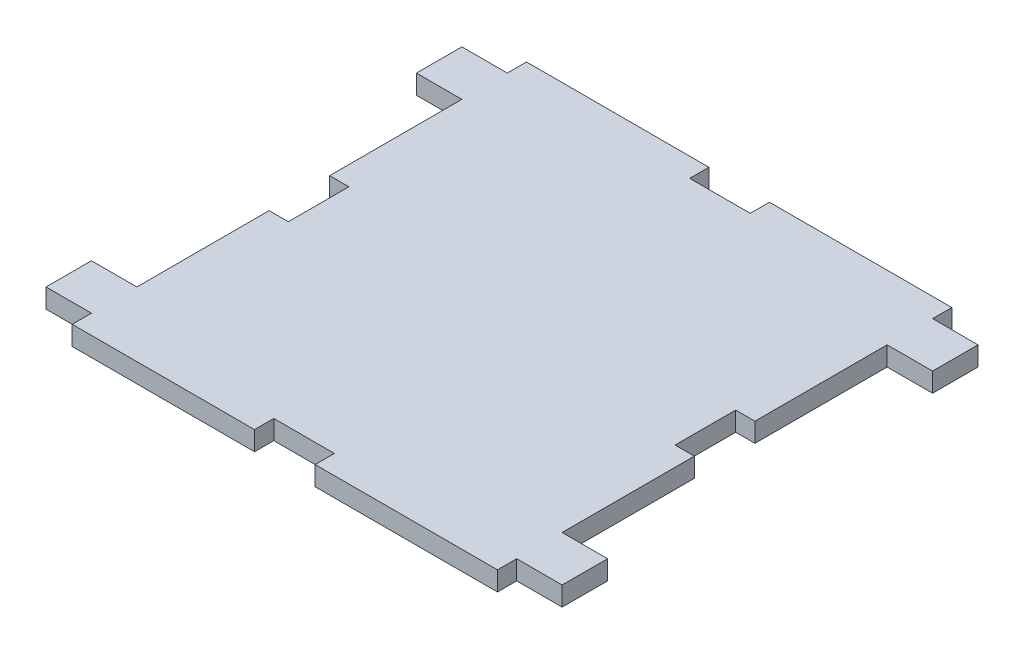
ISO-10303-21;
HEADER;
FILE_DESCRIPTION(('STEP AP214'),'2;1');
FILE_NAME('part.step','',(''),(''),'','','');
FILE_SCHEMA(('AUTOMOTIVE_DESIGN { 1 0 10303 214 1 1 1 1 }'));
ENDSEC;
DATA;
#1=APPLICATION_CONTEXT('core data for automotive mechanical design processes');
#2=APPLICATION_PROTOCOL_DEFINITION('international standard','automotive_design',2000,#1);
#3=PRODUCT_CONTEXT('',#1,'mechanical');
#4=PRODUCT('Part','Part','',(#3));
#5=PRODUCT_RELATED_PRODUCT_CATEGORY('part','',(#4));
#6=PRODUCT_DEFINITION_FORMATION('','',#4);
#7=PRODUCT_DEFINITION_CONTEXT('part definition',#1,'design');
#8=PRODUCT_DEFINITION('design','',#6,#7);
#9=PRODUCT_DEFINITION_SHAPE('','',#8);
#10=(LENGTH_UNIT() NAMED_UNIT(*) SI_UNIT(.MILLI.,.METRE.));
#11=(NAMED_UNIT(*) PLANE_ANGLE_UNIT() SI_UNIT($,.RADIAN.));
#12=(NAMED_UNIT(*) SI_UNIT($,.STERADIAN.) SOLID_ANGLE_UNIT());
#13=UNCERTAINTY_MEASURE_WITH_UNIT(LENGTH_MEASURE(1.E-05),#10,'distance_accuracy_value','');
#14=(GEOMETRIC_REPRESENTATION_CONTEXT(3) GLOBAL_UNCERTAINTY_ASSIGNED_CONTEXT((#13)) GLOBAL_UNIT_ASSIGNED_CONTEXT((#10,
#11,#12)) REPRESENTATION_CONTEXT('',''));
#15=CARTESIAN_POINT('',(0.,0.,0.));
#16=DIRECTION('',(0.,0.,1.));
#17=DIRECTION('',(1.,0.,0.));
#18=AXIS2_PLACEMENT_3D('',#15,#16,#17);
#19=CARTESIAN_POINT('',(-140.4,12.7,150.));
#20=DIRECTION('',(0.,0.,1.));
#21=DIRECTION('',(1.,0.,0.));
#22=AXIS2_PLACEMENT_3D('',#19,#20,#21);
#23=PLANE('',#22);
#24=DIRECTION('',(-1.,0.,0.));
#25=VECTOR('',#24,1.);
#26=CARTESIAN_POINT('',(-140.4,0.,150.));
#27=LINE('',#26,#25);
#28=CARTESIAN_POINT('',(140.4,0.,150.));
#29=VERTEX_POINT('',#28);
#30=CARTESIAN_POINT('',(20.,0.,150.));
#31=VERTEX_POINT('',#30);
#32=EDGE_CURVE('E396',#29,#31,#27,.T.);
#33=ORIENTED_EDGE('',*,*,#32,.F.);
#34=DIRECTION('',(0.,1.,0.));
#35=VECTOR('',#34,1.);
#36=CARTESIAN_POINT('',(140.4,-41.9677256948718,150.));
#37=LINE('',#36,#35);
#38=CARTESIAN_POINT('',(140.4,12.7,150.));
#39=VERTEX_POINT('',#38);
#40=EDGE_CURVE('E376',#29,#39,#37,.T.);
#41=ORIENTED_EDGE('',*,*,#40,.T.);
#42=DIRECTION('',(-1.,0.,0.));
#43=VECTOR('',#42,1.);
#44=CARTESIAN_POINT('',(-140.4,12.7,150.));
#45=LINE('',#44,#43);
#46=CARTESIAN_POINT('',(20.,12.7,150.));
#47=VERTEX_POINT('',#46);
#48=EDGE_CURVE('E750',#39,#47,#45,.T.);
#49=ORIENTED_EDGE('',*,*,#48,.T.);
#50=DIRECTION('',(0.,1.,0.));
#51=VECTOR('',#50,1.);
#52=CARTESIAN_POINT('',(20.,-41.9677256948718,150.));
#53=LINE('',#52,#51);
#54=EDGE_CURVE('E403',#31,#47,#53,.T.);
#55=ORIENTED_EDGE('',*,*,#54,.F.);
#56=EDGE_LOOP('',(#33,#41,#49,#55));
#57=FACE_BOUND('',#56,.T.);
#58=ADVANCED_FACE('F141',(#57),#23,.T.);
#59=DIRECTION('',(0.,1.,0.));
#60=VECTOR('',#59,1.);
#61=CARTESIAN_POINT('',(-140.4,-41.9677256948718,150.));
#62=LINE('',#61,#60);
#63=CARTESIAN_POINT('',(-140.4,0.,150.));
#64=VERTEX_POINT('',#63);
#65=CARTESIAN_POINT('',(-140.4,12.7,150.));
#66=VERTEX_POINT('',#65);
#67=EDGE_CURVE('E400',#64,#66,#62,.T.);
#68=ORIENTED_EDGE('',*,*,#67,.F.);
#69=CARTESIAN_POINT('',(-20.,0.,150.));
#70=VERTEX_POINT('',#69);
#71=EDGE_CURVE('E406',#70,#64,#27,.T.);
#72=ORIENTED_EDGE('',*,*,#71,.F.);
#73=DIRECTION('',(0.,1.,0.));
#74=VECTOR('',#73,1.);
#75=CARTESIAN_POINT('',(-20.,-41.9677256948718,150.));
#76=LINE('',#75,#74);
#77=CARTESIAN_POINT('',(-20.,12.7,150.));
#78=VERTEX_POINT('',#77);
#79=EDGE_CURVE('E167',#70,#78,#76,.T.);
#80=ORIENTED_EDGE('',*,*,#79,.T.);
#81=EDGE_CURVE('E420',#78,#66,#45,.T.);
#82=ORIENTED_EDGE('',*,*,#81,.T.);
#83=EDGE_LOOP('',(#68,#72,#80,#82));
#84=FACE_BOUND('',#83,.T.);
#85=ADVANCED_FACE('F773',(#84),#23,.T.);
#86=CARTESIAN_POINT('',(0.,12.7,0.));
#87=DIRECTION('',(0.,-1.,0.));
#88=DIRECTION('',(0.,0.,-1.));
#89=AXIS2_PLACEMENT_3D('',#86,#87,#88);
#90=PLANE('',#89);
#91=DIRECTION('',(0.,0.,1.));
#92=VECTOR('',#91,1.);
#93=CARTESIAN_POINT('',(-127.7,12.7,-20.));
#94=LINE('',#93,#92);
#95=CARTESIAN_POINT('',(-127.7,12.7,-20.));
#96=VERTEX_POINT('',#95);
#97=CARTESIAN_POINT('',(-127.7,12.7,20.));
#98=VERTEX_POINT('',#97);
#99=EDGE_CURVE('E582',#96,#98,#94,.T.);
#100=ORIENTED_EDGE('',*,*,#99,.T.);
#101=DIRECTION('',(1.,0.,0.));
#102=VECTOR('',#101,1.);
#103=CARTESIAN_POINT('',(-140.4,12.7,19.9999999999999));
#104=LINE('',#103,#102);
#105=CARTESIAN_POINT('',(-140.4,12.7,19.9999999999999));
#106=VERTEX_POINT('',#105);
#107=EDGE_CURVE('E566',#106,#98,#104,.T.);
#108=ORIENTED_EDGE('',*,*,#107,.F.);
#109=DIRECTION('',(0.,0.,1.));
#110=VECTOR('',#109,1.);
#111=CARTESIAN_POINT('',(-140.4,12.7,-150.));
#112=LINE('',#111,#110);
#113=CARTESIAN_POINT('',(-140.4,12.7,107.3));
#114=VERTEX_POINT('',#113);
#115=EDGE_CURVE('E460',#106,#114,#112,.T.);
#116=ORIENTED_EDGE('',*,*,#115,.T.);
#117=DIRECTION('',(-1.,0.,0.));
#118=VECTOR('',#117,1.);
#119=CARTESIAN_POINT('',(-140.4,12.7,107.3));
#120=LINE('',#119,#118);
#121=CARTESIAN_POINT('',(-170.4,12.7,107.3));
#122=VERTEX_POINT('',#121);
#123=EDGE_CURVE('E415',#114,#122,#120,.T.);
#124=ORIENTED_EDGE('',*,*,#123,.T.);
#125=DIRECTION('',(0.,0.,-1.));
#126=VECTOR('',#125,1.);
#127=CARTESIAN_POINT('',(-170.4,12.7,150.));
#128=LINE('',#127,#126);
#129=CARTESIAN_POINT('',(-170.4,12.7,137.3));
#130=VERTEX_POINT('',#129);
#131=EDGE_CURVE('E751',#130,#122,#128,.T.);
#132=ORIENTED_EDGE('',*,*,#131,.F.);
#133=DIRECTION('',(-1.,0.,0.));
#134=VECTOR('',#133,1.);
#135=CARTESIAN_POINT('',(-140.4,12.7,137.3));
#136=LINE('',#135,#134);
#137=CARTESIAN_POINT('',(-140.4,12.7,137.3));
#138=VERTEX_POINT('',#137);
#139=EDGE_CURVE('E716',#138,#130,#136,.T.);
#140=ORIENTED_EDGE('',*,*,#139,.F.);
#141=DIRECTION('',(0.,0.,-1.));
#142=VECTOR('',#141,1.);
#143=CARTESIAN_POINT('',(-140.4,12.7,150.));
#144=LINE('',#143,#142);
#145=EDGE_CURVE('E712',#66,#138,#144,.T.);
#146=ORIENTED_EDGE('',*,*,#145,.F.);
#147=ORIENTED_EDGE('',*,*,#81,.F.);
#148=DIRECTION('',(0.,0.,-1.));
#149=VECTOR('',#148,1.);
#150=CARTESIAN_POINT('',(-20.0000000000001,12.7,0.));
#151=LINE('',#150,#149);
#152=CARTESIAN_POINT('',(-20.,12.7,137.3));
#153=VERTEX_POINT('',#152);
#154=EDGE_CURVE('E509',#78,#153,#151,.T.);
#155=ORIENTED_EDGE('',*,*,#154,.T.);
#156=DIRECTION('',(1.,0.,0.));
#157=VECTOR('',#156,1.);
#158=CARTESIAN_POINT('',(0.,12.7,137.3));
#159=LINE('',#158,#157);
#160=CARTESIAN_POINT('',(20.,12.7,137.3));
#161=VERTEX_POINT('',#160);
#162=EDGE_CURVE('E535',#153,#161,#159,.T.);
#163=ORIENTED_EDGE('',*,*,#162,.T.);
#164=DIRECTION('',(0.,0.,-1.));
#165=VECTOR('',#164,1.);
#166=CARTESIAN_POINT('',(20.,12.7,0.));
#167=LINE('',#166,#165);
#168=EDGE_CURVE('E550',#47,#161,#167,.T.);
#169=ORIENTED_EDGE('',*,*,#168,.F.);
#170=ORIENTED_EDGE('',*,*,#48,.F.);
#171=DIRECTION('',(0.,0.,-1.));
#172=VECTOR('',#171,1.);
#173=CARTESIAN_POINT('',(140.4,12.7,150.));
#174=LINE('',#173,#172);
#175=CARTESIAN_POINT('',(140.4,12.7,137.3));
#176=VERTEX_POINT('',#175);
#177=EDGE_CURVE('E382',#39,#176,#174,.T.);
#178=ORIENTED_EDGE('',*,*,#177,.T.);
#179=DIRECTION('',(1.,0.,0.));
#180=VECTOR('',#179,1.);
#181=CARTESIAN_POINT('',(140.4,12.7,137.3));
#182=LINE('',#181,#180);
#183=CARTESIAN_POINT('',(170.4,12.7,137.3));
#184=VERTEX_POINT('',#183);
#185=EDGE_CURVE('E388',#176,#184,#182,.T.);
#186=ORIENTED_EDGE('',*,*,#185,.T.);
#187=DIRECTION('',(0.,0.,-1.));
#188=VECTOR('',#187,1.);
#189=CARTESIAN_POINT('',(170.4,12.7,150.));
#190=LINE('',#189,#188);
#191=CARTESIAN_POINT('',(170.4,12.7,107.3));
#192=VERTEX_POINT('',#191);
#193=EDGE_CURVE('E501',#184,#192,#190,.T.);
#194=ORIENTED_EDGE('',*,*,#193,.T.);
#195=DIRECTION('',(1.,0.,0.));
#196=VECTOR('',#195,1.);
#197=CARTESIAN_POINT('',(140.4,12.7,107.3));
#198=LINE('',#197,#196);
#199=CARTESIAN_POINT('',(140.4,12.7,107.3));
#200=VERTEX_POINT('',#199);
#201=EDGE_CURVE('E497',#200,#192,#198,.T.);
#202=ORIENTED_EDGE('',*,*,#201,.F.);
#203=DIRECTION('',(0.,0.,1.));
#204=VECTOR('',#203,1.);
#205=CARTESIAN_POINT('',(140.4,12.7,-150.));
#206=LINE('',#205,#204);
#207=CARTESIAN_POINT('',(140.4,12.7,19.9999999999999));
#208=VERTEX_POINT('',#207);
#209=EDGE_CURVE('E461',#208,#200,#206,.T.);
#210=ORIENTED_EDGE('',*,*,#209,.F.);
#211=DIRECTION('',(-1.,0.,0.));
#212=VECTOR('',#211,1.);
#213=CARTESIAN_POINT('',(140.4,12.7,19.9999999999999));
#214=LINE('',#213,#212);
#215=CARTESIAN_POINT('',(127.7,12.7,20.));
#216=VERTEX_POINT('',#215);
#217=EDGE_CURVE('E613',#208,#216,#214,.T.);
#218=ORIENTED_EDGE('',*,*,#217,.T.);
#219=DIRECTION('',(0.,0.,1.));
#220=VECTOR('',#219,1.);
#221=CARTESIAN_POINT('',(127.7,12.7,-20.));
#222=LINE('',#221,#220);
#223=CARTESIAN_POINT('',(127.7,12.7,-20.));
#224=VERTEX_POINT('',#223);
#225=EDGE_CURVE('E600',#224,#216,#222,.T.);
#226=ORIENTED_EDGE('',*,*,#225,.F.);
#227=DIRECTION('',(-1.,0.,0.));
#228=VECTOR('',#227,1.);
#229=CARTESIAN_POINT('',(140.4,12.7,-20.));
#230=LINE('',#229,#228);
#231=CARTESIAN_POINT('',(140.4,12.7,-20.));
#232=VERTEX_POINT('',#231);
#233=EDGE_CURVE('E596',#232,#224,#230,.T.);
#234=ORIENTED_EDGE('',*,*,#233,.F.);
#235=CARTESIAN_POINT('',(140.4,12.7,-107.3));
#236=VERTEX_POINT('',#235);
#237=EDGE_CURVE('E456',#236,#232,#206,.T.);
#238=ORIENTED_EDGE('',*,*,#237,.F.);
#239=DIRECTION('',(1.,0.,0.));
#240=VECTOR('',#239,1.);
#241=CARTESIAN_POINT('',(140.4,12.7,-107.3));
#242=LINE('',#241,#240);
#243=CARTESIAN_POINT('',(170.4,12.7,-107.3));
#244=VERTEX_POINT('',#243);
#245=EDGE_CURVE('E477',#236,#244,#242,.T.);
#246=ORIENTED_EDGE('',*,*,#245,.T.);
#247=DIRECTION('',(0.,0.,1.));
#248=VECTOR('',#247,1.);
#249=CARTESIAN_POINT('',(170.4,12.7,-150.));
#250=LINE('',#249,#248);
#251=CARTESIAN_POINT('',(170.4,12.7,-137.3));
#252=VERTEX_POINT('',#251);
#253=EDGE_CURVE('E481',#252,#244,#250,.T.);
#254=ORIENTED_EDGE('',*,*,#253,.F.);
#255=DIRECTION('',(1.,0.,0.));
#256=VECTOR('',#255,1.);
#257=CARTESIAN_POINT('',(140.4,12.7,-137.3));
#258=LINE('',#257,#256);
#259=CARTESIAN_POINT('',(140.4,12.7,-137.3));
#260=VERTEX_POINT('',#259);
#261=EDGE_CURVE('E705',#260,#252,#258,.T.);
#262=ORIENTED_EDGE('',*,*,#261,.F.);
#263=DIRECTION('',(0.,0.,1.));
#264=VECTOR('',#263,1.);
#265=CARTESIAN_POINT('',(140.4,12.7,-150.));
#266=LINE('',#265,#264);
#267=CARTESIAN_POINT('',(140.4,12.7,-150.));
#268=VERTEX_POINT('',#267);
#269=EDGE_CURVE('E708',#268,#260,#266,.T.);
#270=ORIENTED_EDGE('',*,*,#269,.F.);
#271=DIRECTION('',(-1.,0.,0.));
#272=VECTOR('',#271,1.);
#273=CARTESIAN_POINT('',(-140.4,12.7,-150.));
#274=LINE('',#273,#272);
#275=CARTESIAN_POINT('',(20.,12.7,-150.));
#276=VERTEX_POINT('',#275);
#277=EDGE_CURVE('E429',#268,#276,#274,.T.);
#278=ORIENTED_EDGE('',*,*,#277,.T.);
#279=DIRECTION('',(0.,0.,1.));
#280=VECTOR('',#279,1.);
#281=CARTESIAN_POINT('',(20.,12.7,-150.));
#282=LINE('',#281,#280);
#283=CARTESIAN_POINT('',(20.,12.7,-137.3));
#284=VERTEX_POINT('',#283);
#285=EDGE_CURVE('E649',#276,#284,#282,.T.);
#286=ORIENTED_EDGE('',*,*,#285,.T.);
#287=DIRECTION('',(1.,0.,0.));
#288=VECTOR('',#287,1.);
#289=CARTESIAN_POINT('',(-20.,12.7,-137.3));
#290=LINE('',#289,#288);
#291=CARTESIAN_POINT('',(-20.,12.7,-137.3));
#292=VERTEX_POINT('',#291);
#293=EDGE_CURVE('E634',#292,#284,#290,.T.);
#294=ORIENTED_EDGE('',*,*,#293,.F.);
#295=DIRECTION('',(0.,0.,1.));
#296=VECTOR('',#295,1.);
#297=CARTESIAN_POINT('',(-20.,12.7,-150.));
#298=LINE('',#297,#296);
#299=CARTESIAN_POINT('',(-20.,12.7,-150.));
#300=VERTEX_POINT('',#299);
#301=EDGE_CURVE('E630',#300,#292,#298,.T.);
#302=ORIENTED_EDGE('',*,*,#301,.F.);
#303=CARTESIAN_POINT('',(-140.4,12.7,-150.));
#304=VERTEX_POINT('',#303);
#305=EDGE_CURVE('E425',#300,#304,#274,.T.);
#306=ORIENTED_EDGE('',*,*,#305,.T.);
#307=DIRECTION('',(0.,0.,1.));
#308=VECTOR('',#307,1.);
#309=CARTESIAN_POINT('',(-140.4,12.7,-150.));
#310=LINE('',#309,#308);
#311=CARTESIAN_POINT('',(-140.4,12.7,-137.3));
#312=VERTEX_POINT('',#311);
#313=EDGE_CURVE('E683',#304,#312,#310,.T.);
#314=ORIENTED_EDGE('',*,*,#313,.T.);
#315=DIRECTION('',(-1.,0.,0.));
#316=VECTOR('',#315,1.);
#317=CARTESIAN_POINT('',(-140.4,12.7,-137.3));
#318=LINE('',#317,#316);
#319=CARTESIAN_POINT('',(-170.4,12.7,-137.3));
#320=VERTEX_POINT('',#319);
#321=EDGE_CURVE('E675',#312,#320,#318,.T.);
#322=ORIENTED_EDGE('',*,*,#321,.T.);
#323=DIRECTION('',(0.,0.,1.));
#324=VECTOR('',#323,1.);
#325=CARTESIAN_POINT('',(-170.4,12.7,-150.));
#326=LINE('',#325,#324);
#327=CARTESIAN_POINT('',(-170.4,12.7,-107.3));
#328=VERTEX_POINT('',#327);
#329=EDGE_CURVE('E431',#320,#328,#326,.T.);
#330=ORIENTED_EDGE('',*,*,#329,.T.);
#331=DIRECTION('',(-1.,0.,0.));
#332=VECTOR('',#331,1.);
#333=CARTESIAN_POINT('',(-140.4,12.7,-107.3));
#334=LINE('',#333,#332);
#335=CARTESIAN_POINT('',(-140.4,12.7,-107.3));
#336=VERTEX_POINT('',#335);
#337=EDGE_CURVE('E434',#336,#328,#334,.T.);
#338=ORIENTED_EDGE('',*,*,#337,.F.);
#339=CARTESIAN_POINT('',(-140.4,12.7,-20.));
#340=VERTEX_POINT('',#339);
#341=EDGE_CURVE('E462',#336,#340,#112,.T.);
#342=ORIENTED_EDGE('',*,*,#341,.T.);
#343=DIRECTION('',(1.,0.,0.));
#344=VECTOR('',#343,1.);
#345=CARTESIAN_POINT('',(-140.4,12.7,-20.));
#346=LINE('',#345,#344);
#347=EDGE_CURVE('E590',#340,#96,#346,.T.);
#348=ORIENTED_EDGE('',*,*,#347,.T.);
#349=EDGE_LOOP('',(#100,#108,#116,#124,#132,#140,#146,#147,#155,#163,#169,#170,#178,#186,#194,
#202,#210,#218,#226,#234,#238,#246,#254,#262,#270,#278,#286,#294,#302,#306,#314,#322,#330,#338,
#342,#348));
#350=FACE_BOUND('',#349,.T.);
#351=ADVANCED_FACE('F759',(#350),#90,.F.);
#352=CARTESIAN_POINT('',(0.,0.,0.));
#353=DIRECTION('',(0.,-1.,0.));
#354=DIRECTION('',(0.,0.,-1.));
#355=AXIS2_PLACEMENT_3D('',#352,#353,#354);
#356=PLANE('',#355);
#357=DIRECTION('',(1.,0.,0.));
#358=VECTOR('',#357,1.);
#359=CARTESIAN_POINT('',(-140.4,0.,19.9999999999999));
#360=LINE('',#359,#358);
#361=CARTESIAN_POINT('',(-140.4,0.,19.9999999999999));
#362=VERTEX_POINT('',#361);
#363=CARTESIAN_POINT('',(-127.7,0.,20.));
#364=VERTEX_POINT('',#363);
#365=EDGE_CURVE('E573',#362,#364,#360,.T.);
#366=ORIENTED_EDGE('',*,*,#365,.T.);
#367=DIRECTION('',(0.,0.,1.));
#368=VECTOR('',#367,1.);
#369=CARTESIAN_POINT('',(-127.7,0.,-20.));
#370=LINE('',#369,#368);
#371=CARTESIAN_POINT('',(-127.7,0.,-20.));
#372=VERTEX_POINT('',#371);
#373=EDGE_CURVE('E563',#372,#364,#370,.T.);
#374=ORIENTED_EDGE('',*,*,#373,.F.);
#375=DIRECTION('',(1.,0.,0.));
#376=VECTOR('',#375,1.);
#377=CARTESIAN_POINT('',(-140.4,0.,-20.));
#378=LINE('',#377,#376);
#379=CARTESIAN_POINT('',(-140.4,0.,-20.));
#380=VERTEX_POINT('',#379);
#381=EDGE_CURVE('E560',#380,#372,#378,.T.);
#382=ORIENTED_EDGE('',*,*,#381,.F.);
#383=DIRECTION('',(0.,0.,1.));
#384=VECTOR('',#383,1.);
#385=CARTESIAN_POINT('',(-140.4,0.,-150.));
#386=LINE('',#385,#384);
#387=CARTESIAN_POINT('',(-140.4,0.,-107.3));
#388=VERTEX_POINT('',#387);
#389=EDGE_CURVE('E473',#388,#380,#386,.T.);
#390=ORIENTED_EDGE('',*,*,#389,.F.);
#391=DIRECTION('',(-1.,0.,0.));
#392=VECTOR('',#391,1.);
#393=CARTESIAN_POINT('',(-140.4,0.,-107.3));
#394=LINE('',#393,#392);
#395=CARTESIAN_POINT('',(-170.4,0.,-107.3));
#396=VERTEX_POINT('',#395);
#397=EDGE_CURVE('E430',#388,#396,#394,.T.);
#398=ORIENTED_EDGE('',*,*,#397,.T.);
#399=DIRECTION('',(0.,0.,1.));
#400=VECTOR('',#399,1.);
#401=CARTESIAN_POINT('',(-170.4,0.,-150.));
#402=LINE('',#401,#400);
#403=CARTESIAN_POINT('',(-170.4,0.,-137.3));
#404=VERTEX_POINT('',#403);
#405=EDGE_CURVE('E445',#404,#396,#402,.T.);
#406=ORIENTED_EDGE('',*,*,#405,.F.);
#407=DIRECTION('',(-1.,0.,0.));
#408=VECTOR('',#407,1.);
#409=CARTESIAN_POINT('',(-140.4,0.,-137.3));
#410=LINE('',#409,#408);
#411=CARTESIAN_POINT('',(-140.4,0.,-137.3));
#412=VERTEX_POINT('',#411);
#413=EDGE_CURVE('E666',#412,#404,#410,.T.);
#414=ORIENTED_EDGE('',*,*,#413,.F.);
#415=DIRECTION('',(0.,0.,1.));
#416=VECTOR('',#415,1.);
#417=CARTESIAN_POINT('',(-140.4,0.,-150.));
#418=LINE('',#417,#416);
#419=CARTESIAN_POINT('',(-140.4,0.,-150.));
#420=VERTEX_POINT('',#419);
#421=EDGE_CURVE('E663',#420,#412,#418,.T.);
#422=ORIENTED_EDGE('',*,*,#421,.F.);
#423=DIRECTION('',(-1.,0.,0.));
#424=VECTOR('',#423,1.);
#425=CARTESIAN_POINT('',(-140.4,0.,-150.));
#426=LINE('',#425,#424);
#427=CARTESIAN_POINT('',(-20.,0.,-150.));
#428=VERTEX_POINT('',#427);
#429=EDGE_CURVE('E439',#428,#420,#426,.T.);
#430=ORIENTED_EDGE('',*,*,#429,.F.);
#431=DIRECTION('',(0.,0.,1.));
#432=VECTOR('',#431,1.);
#433=CARTESIAN_POINT('',(-20.,0.,-150.));
#434=LINE('',#433,#432);
#435=CARTESIAN_POINT('',(-20.,0.,-137.3));
#436=VERTEX_POINT('',#435);
#437=EDGE_CURVE('E656',#428,#436,#434,.T.);
#438=ORIENTED_EDGE('',*,*,#437,.T.);
#439=DIRECTION('',(1.,0.,0.));
#440=VECTOR('',#439,1.);
#441=CARTESIAN_POINT('',(-20.,0.,-137.3));
#442=LINE('',#441,#440);
#443=CARTESIAN_POINT('',(20.,0.,-137.3));
#444=VERTEX_POINT('',#443);
#445=EDGE_CURVE('E638',#436,#444,#442,.T.);
#446=ORIENTED_EDGE('',*,*,#445,.T.);
#447=DIRECTION('',(0.,0.,1.));
#448=VECTOR('',#447,1.);
#449=CARTESIAN_POINT('',(20.,0.,-150.));
#450=LINE('',#449,#448);
#451=CARTESIAN_POINT('',(20.,0.,-150.));
#452=VERTEX_POINT('',#451);
#453=EDGE_CURVE('E627',#452,#444,#450,.T.);
#454=ORIENTED_EDGE('',*,*,#453,.F.);
#455=CARTESIAN_POINT('',(140.4,0.,-150.));
#456=VERTEX_POINT('',#455);
#457=EDGE_CURVE('E443',#456,#452,#426,.T.);
#458=ORIENTED_EDGE('',*,*,#457,.F.);
#459=DIRECTION('',(0.,0.,1.));
#460=VECTOR('',#459,1.);
#461=CARTESIAN_POINT('',(140.4,0.,-150.));
#462=LINE('',#461,#460);
#463=CARTESIAN_POINT('',(140.4,0.,-137.3));
#464=VERTEX_POINT('',#463);
#465=EDGE_CURVE('E695',#456,#464,#462,.T.);
#466=ORIENTED_EDGE('',*,*,#465,.T.);
#467=DIRECTION('',(1.,0.,0.));
#468=VECTOR('',#467,1.);
#469=CARTESIAN_POINT('',(140.4,0.,-137.3));
#470=LINE('',#469,#468);
#471=CARTESIAN_POINT('',(170.4,0.,-137.3));
#472=VERTEX_POINT('',#471);
#473=EDGE_CURVE('E687',#464,#472,#470,.T.);
#474=ORIENTED_EDGE('',*,*,#473,.T.);
#475=DIRECTION('',(0.,0.,1.));
#476=VECTOR('',#475,1.);
#477=CARTESIAN_POINT('',(170.4,0.,-150.));
#478=LINE('',#477,#476);
#479=CARTESIAN_POINT('',(170.4,0.,-107.3));
#480=VERTEX_POINT('',#479);
#481=EDGE_CURVE('E482',#472,#480,#478,.T.);
#482=ORIENTED_EDGE('',*,*,#481,.T.);
#483=DIRECTION('',(1.,0.,0.));
#484=VECTOR('',#483,1.);
#485=CARTESIAN_POINT('',(140.4,0.,-107.3));
#486=LINE('',#485,#484);
#487=CARTESIAN_POINT('',(140.4,0.,-107.3));
#488=VERTEX_POINT('',#487);
#489=EDGE_CURVE('E486',#488,#480,#486,.T.);
#490=ORIENTED_EDGE('',*,*,#489,.F.);
#491=DIRECTION('',(0.,0.,1.));
#492=VECTOR('',#491,1.);
#493=CARTESIAN_POINT('',(140.4,0.,-150.));
#494=LINE('',#493,#492);
#495=CARTESIAN_POINT('',(140.4,0.,-20.));
#496=VERTEX_POINT('',#495);
#497=EDGE_CURVE('E467',#488,#496,#494,.T.);
#498=ORIENTED_EDGE('',*,*,#497,.T.);
#499=DIRECTION('',(-1.,0.,0.));
#500=VECTOR('',#499,1.);
#501=CARTESIAN_POINT('',(140.4,0.,-20.));
#502=LINE('',#501,#500);
#503=CARTESIAN_POINT('',(127.7,0.,-20.));
#504=VERTEX_POINT('',#503);
#505=EDGE_CURVE('E620',#496,#504,#502,.T.);
#506=ORIENTED_EDGE('',*,*,#505,.T.);
#507=DIRECTION('',(0.,0.,1.));
#508=VECTOR('',#507,1.);
#509=CARTESIAN_POINT('',(127.7,0.,-20.));
#510=LINE('',#509,#508);
#511=CARTESIAN_POINT('',(127.7,0.,20.));
#512=VERTEX_POINT('',#511);
#513=EDGE_CURVE('E604',#504,#512,#510,.T.);
#514=ORIENTED_EDGE('',*,*,#513,.T.);
#515=DIRECTION('',(-1.,0.,0.));
#516=VECTOR('',#515,1.);
#517=CARTESIAN_POINT('',(140.4,0.,19.9999999999999));
#518=LINE('',#517,#516);
#519=CARTESIAN_POINT('',(140.4,0.,19.9999999999999));
#520=VERTEX_POINT('',#519);
#521=EDGE_CURVE('E526',#520,#512,#518,.T.);
#522=ORIENTED_EDGE('',*,*,#521,.F.);
#523=CARTESIAN_POINT('',(140.4,0.,107.3));
#524=VERTEX_POINT('',#523);
#525=EDGE_CURVE('E472',#520,#524,#494,.T.);
#526=ORIENTED_EDGE('',*,*,#525,.T.);
#527=DIRECTION('',(1.,0.,0.));
#528=VECTOR('',#527,1.);
#529=CARTESIAN_POINT('',(140.4,0.,107.3));
#530=LINE('',#529,#528);
#531=CARTESIAN_POINT('',(170.4,0.,107.3));
#532=VERTEX_POINT('',#531);
#533=EDGE_CURVE('E505',#524,#532,#530,.T.);
#534=ORIENTED_EDGE('',*,*,#533,.T.);
#535=DIRECTION('',(0.,0.,-1.));
#536=VECTOR('',#535,1.);
#537=CARTESIAN_POINT('',(170.4,0.,150.));
#538=LINE('',#537,#536);
#539=CARTESIAN_POINT('',(170.4,0.,137.3));
#540=VERTEX_POINT('',#539);
#541=EDGE_CURVE('E502',#540,#532,#538,.T.);
#542=ORIENTED_EDGE('',*,*,#541,.F.);
#543=DIRECTION('',(1.,0.,0.));
#544=VECTOR('',#543,1.);
#545=CARTESIAN_POINT('',(140.4,0.,137.3));
#546=LINE('',#545,#544);
#547=CARTESIAN_POINT('',(140.4,0.,137.3));
#548=VERTEX_POINT('',#547);
#549=EDGE_CURVE('E398',#548,#540,#546,.T.);
#550=ORIENTED_EDGE('',*,*,#549,.F.);
#551=DIRECTION('',(0.,0.,-1.));
#552=VECTOR('',#551,1.);
#553=CARTESIAN_POINT('',(140.4,0.,150.));
#554=LINE('',#553,#552);
#555=EDGE_CURVE('E379',#29,#548,#554,.T.);
#556=ORIENTED_EDGE('',*,*,#555,.F.);
#557=ORIENTED_EDGE('',*,*,#32,.T.);
#558=DIRECTION('',(0.,0.,-1.));
#559=VECTOR('',#558,1.);
#560=CARTESIAN_POINT('',(20.,0.,0.));
#561=LINE('',#560,#559);
#562=CARTESIAN_POINT('',(20.,0.,137.3));
#563=VERTEX_POINT('',#562);
#564=EDGE_CURVE('E545',#31,#563,#561,.T.);
#565=ORIENTED_EDGE('',*,*,#564,.T.);
#566=DIRECTION('',(1.,0.,0.));
#567=VECTOR('',#566,1.);
#568=CARTESIAN_POINT('',(0.,0.,137.3));
#569=LINE('',#568,#567);
#570=CARTESIAN_POINT('',(-20.,0.,137.3));
#571=VERTEX_POINT('',#570);
#572=EDGE_CURVE('E554',#571,#563,#569,.T.);
#573=ORIENTED_EDGE('',*,*,#572,.F.);
#574=DIRECTION('',(0.,0.,-1.));
#575=VECTOR('',#574,1.);
#576=CARTESIAN_POINT('',(-20.0000000000001,0.,0.));
#577=LINE('',#576,#575);
#578=EDGE_CURVE('E557',#70,#571,#577,.T.);
#579=ORIENTED_EDGE('',*,*,#578,.F.);
#580=ORIENTED_EDGE('',*,*,#71,.T.);
#581=DIRECTION('',(0.,0.,-1.));
#582=VECTOR('',#581,1.);
#583=CARTESIAN_POINT('',(-140.4,0.,150.));
#584=LINE('',#583,#582);
#585=CARTESIAN_POINT('',(-140.4,0.,137.3));
#586=VERTEX_POINT('',#585);
#587=EDGE_CURVE('E719',#64,#586,#584,.T.);
#588=ORIENTED_EDGE('',*,*,#587,.T.);
#589=DIRECTION('',(-1.,0.,0.));
#590=VECTOR('',#589,1.);
#591=CARTESIAN_POINT('',(-140.4,0.,137.3));
#592=LINE('',#591,#590);
#593=CARTESIAN_POINT('',(-170.4,0.,137.3));
#594=VERTEX_POINT('',#593);
#595=EDGE_CURVE('E726',#586,#594,#592,.T.);
#596=ORIENTED_EDGE('',*,*,#595,.T.);
#597=DIRECTION('',(0.,0.,-1.));
#598=VECTOR('',#597,1.);
#599=CARTESIAN_POINT('',(-170.4,0.,150.));
#600=LINE('',#599,#598);
#601=CARTESIAN_POINT('',(-170.4,0.,107.3));
#602=VERTEX_POINT('',#601);
#603=EDGE_CURVE('E405',#594,#602,#600,.T.);
#604=ORIENTED_EDGE('',*,*,#603,.T.);
#605=DIRECTION('',(-1.,0.,0.));
#606=VECTOR('',#605,1.);
#607=CARTESIAN_POINT('',(-140.4,0.,107.3));
#608=LINE('',#607,#606);
#609=CARTESIAN_POINT('',(-140.4,0.,107.3));
#610=VERTEX_POINT('',#609);
#611=EDGE_CURVE('E410',#610,#602,#608,.T.);
#612=ORIENTED_EDGE('',*,*,#611,.F.);
#613=EDGE_CURVE('E471',#362,#610,#386,.T.);
#614=ORIENTED_EDGE('',*,*,#613,.F.);
#615=EDGE_LOOP('',(#366,#374,#382,#390,#398,#406,#414,#422,#430,#438,#446,#454,#458,#466,#474,
#482,#490,#498,#506,#514,#522,#526,#534,#542,#550,#556,#557,#565,#573,#579,#580,#588,#596,#604,
#612,#614));
#616=FACE_BOUND('',#615,.T.);
#617=ADVANCED_FACE('F394',(#616),#356,.T.);
#618=CARTESIAN_POINT('',(170.4,12.7,150.));
#619=DIRECTION('',(-1.,0.,0.));
#620=DIRECTION('',(0.,0.,1.));
#621=AXIS2_PLACEMENT_3D('',#618,#619,#620);
#622=PLANE('',#621);
#623=DIRECTION('',(0.,1.,0.));
#624=VECTOR('',#623,1.);
#625=CARTESIAN_POINT('',(170.4,-41.9677256948718,137.3));
#626=LINE('',#625,#624);
#627=EDGE_CURVE('E735',#540,#184,#626,.T.);
#628=ORIENTED_EDGE('',*,*,#627,.F.);
#629=ORIENTED_EDGE('',*,*,#541,.T.);
#630=DIRECTION('',(0.,-1.,0.));
#631=VECTOR('',#630,1.);
#632=CARTESIAN_POINT('',(170.4,12.7,107.3));
#633=LINE('',#632,#631);
#634=EDGE_CURVE('E145',#192,#532,#633,.T.);
#635=ORIENTED_EDGE('',*,*,#634,.F.);
#636=ORIENTED_EDGE('',*,*,#193,.F.);
#637=EDGE_LOOP('',(#628,#629,#635,#636));
#638=FACE_BOUND('',#637,.T.);
#639=ADVANCED_FACE('F830',(#638),#622,.F.);
#640=CARTESIAN_POINT('',(-170.4,12.7,-150.));
#641=DIRECTION('',(1.,0.,0.));
#642=DIRECTION('',(0.,0.,-1.));
#643=AXIS2_PLACEMENT_3D('',#640,#641,#642);
#644=PLANE('',#643);
#645=DIRECTION('',(0.,1.,0.));
#646=VECTOR('',#645,1.);
#647=CARTESIAN_POINT('',(-170.4,-41.9677256948718,-137.3));
#648=LINE('',#647,#646);
#649=EDGE_CURVE('E669',#404,#320,#648,.T.);
#650=ORIENTED_EDGE('',*,*,#649,.F.);
#651=ORIENTED_EDGE('',*,*,#405,.T.);
#652=DIRECTION('',(0.,-1.,0.));
#653=VECTOR('',#652,1.);
#654=CARTESIAN_POINT('',(-170.4,12.7,-107.3));
#655=LINE('',#654,#653);
#656=EDGE_CURVE('E413',#328,#396,#655,.T.);
#657=ORIENTED_EDGE('',*,*,#656,.F.);
#658=ORIENTED_EDGE('',*,*,#329,.F.);
#659=EDGE_LOOP('',(#650,#651,#657,#658));
#660=FACE_BOUND('',#659,.T.);
#661=ADVANCED_FACE('F827',(#660),#644,.F.);
#662=CARTESIAN_POINT('',(-140.4,12.7,-150.));
#663=DIRECTION('',(0.,0.,1.));
#664=DIRECTION('',(1.,0.,0.));
#665=AXIS2_PLACEMENT_3D('',#662,#663,#664);
#666=PLANE('',#665);
#667=DIRECTION('',(0.,1.,0.));
#668=VECTOR('',#667,1.);
#669=CARTESIAN_POINT('',(20.,-41.9677256948718,-150.));
#670=LINE('',#669,#668);
#671=EDGE_CURVE('E645',#452,#276,#670,.T.);
#672=ORIENTED_EDGE('',*,*,#671,.T.);
#673=ORIENTED_EDGE('',*,*,#277,.F.);
#674=DIRECTION('',(0.,1.,0.));
#675=VECTOR('',#674,1.);
#676=CARTESIAN_POINT('',(140.4,-41.9677256948718,-150.));
#677=LINE('',#676,#675);
#678=EDGE_CURVE('E702',#456,#268,#677,.T.);
#679=ORIENTED_EDGE('',*,*,#678,.F.);
#680=ORIENTED_EDGE('',*,*,#457,.T.);
#681=EDGE_LOOP('',(#672,#673,#679,#680));
#682=FACE_BOUND('',#681,.T.);
#683=ADVANCED_FACE('F829',(#682),#666,.F.);
#684=ORIENTED_EDGE('',*,*,#305,.F.);
#685=DIRECTION('',(0.,1.,0.));
#686=VECTOR('',#685,1.);
#687=CARTESIAN_POINT('',(-20.,-41.9677256948718,-150.));
#688=LINE('',#687,#686);
#689=EDGE_CURVE('E653',#428,#300,#688,.T.);
#690=ORIENTED_EDGE('',*,*,#689,.F.);
#691=ORIENTED_EDGE('',*,*,#429,.T.);
#692=DIRECTION('',(0.,1.,0.));
#693=VECTOR('',#692,1.);
#694=CARTESIAN_POINT('',(-140.4,-41.9677256948718,-150.));
#695=LINE('',#694,#693);
#696=EDGE_CURVE('E679',#420,#304,#695,.T.);
#697=ORIENTED_EDGE('',*,*,#696,.T.);
#698=EDGE_LOOP('',(#684,#690,#691,#697));
#699=FACE_BOUND('',#698,.T.);
#700=ADVANCED_FACE('F833',(#699),#666,.F.);
#701=CARTESIAN_POINT('',(140.4,12.7,-150.));
#702=DIRECTION('',(1.,0.,0.));
#703=DIRECTION('',(0.,0.,-1.));
#704=AXIS2_PLACEMENT_3D('',#701,#702,#703);
#705=PLANE('',#704);
#706=ORIENTED_EDGE('',*,*,#525,.F.);
#707=DIRECTION('',(0.,1.,0.));
#708=VECTOR('',#707,1.);
#709=CARTESIAN_POINT('',(140.4,-41.9677256948718,19.9999999999999));
#710=LINE('',#709,#708);
#711=EDGE_CURVE('E610',#520,#208,#710,.T.);
#712=ORIENTED_EDGE('',*,*,#711,.T.);
#713=ORIENTED_EDGE('',*,*,#209,.T.);
#714=DIRECTION('',(0.,-1.,0.));
#715=VECTOR('',#714,1.);
#716=CARTESIAN_POINT('',(140.4,12.7,107.3));
#717=LINE('',#716,#715);
#718=EDGE_CURVE('E466',#200,#524,#717,.T.);
#719=ORIENTED_EDGE('',*,*,#718,.T.);
#720=EDGE_LOOP('',(#706,#712,#713,#719));
#721=FACE_BOUND('',#720,.T.);
#722=ADVANCED_FACE('F517',(#721),#705,.T.);
#723=CARTESIAN_POINT('',(-140.4,12.7,-150.));
#724=DIRECTION('',(1.,0.,0.));
#725=DIRECTION('',(0.,0.,-1.));
#726=AXIS2_PLACEMENT_3D('',#723,#724,#725);
#727=PLANE('',#726);
#728=DIRECTION('',(0.,1.,0.));
#729=VECTOR('',#728,1.);
#730=CARTESIAN_POINT('',(-140.4,-41.9677256948718,-20.));
#731=LINE('',#730,#729);
#732=EDGE_CURVE('E586',#380,#340,#731,.T.);
#733=ORIENTED_EDGE('',*,*,#732,.T.);
#734=ORIENTED_EDGE('',*,*,#341,.F.);
#735=DIRECTION('',(0.,-1.,0.));
#736=VECTOR('',#735,1.);
#737=CARTESIAN_POINT('',(-140.4,12.7,-107.3));
#738=LINE('',#737,#736);
#739=EDGE_CURVE('E438',#336,#388,#738,.T.);
#740=ORIENTED_EDGE('',*,*,#739,.T.);
#741=ORIENTED_EDGE('',*,*,#389,.T.);
#742=EDGE_LOOP('',(#733,#734,#740,#741));
#743=FACE_BOUND('',#742,.T.);
#744=ADVANCED_FACE('F800',(#743),#727,.F.);
#745=CARTESIAN_POINT('',(-140.4,12.7,107.3));
#746=DIRECTION('',(0.,0.,1.));
#747=DIRECTION('',(1.,0.,0.));
#748=AXIS2_PLACEMENT_3D('',#745,#746,#747);
#749=PLANE('',#748);
#750=ORIENTED_EDGE('',*,*,#611,.T.);
#751=DIRECTION('',(0.,-1.,0.));
#752=VECTOR('',#751,1.);
#753=CARTESIAN_POINT('',(-170.4,12.7,107.3));
#754=LINE('',#753,#752);
#755=EDGE_CURVE('E151',#122,#602,#754,.T.);
#756=ORIENTED_EDGE('',*,*,#755,.F.);
#757=ORIENTED_EDGE('',*,*,#123,.F.);
#758=DIRECTION('',(0.,-1.,0.));
#759=VECTOR('',#758,1.);
#760=CARTESIAN_POINT('',(-140.4,12.7,107.3));
#761=LINE('',#760,#759);
#762=EDGE_CURVE('E12',#114,#610,#761,.T.);
#763=ORIENTED_EDGE('',*,*,#762,.T.);
#764=EDGE_LOOP('',(#750,#756,#757,#763));
#765=FACE_BOUND('',#764,.T.);
#766=ADVANCED_FACE('F785',(#765),#749,.F.);
#767=CARTESIAN_POINT('',(-170.4,12.7,150.));
#768=DIRECTION('',(-1.,0.,0.));
#769=DIRECTION('',(0.,0.,1.));
#770=AXIS2_PLACEMENT_3D('',#767,#768,#769);
#771=PLANE('',#770);
#772=DIRECTION('',(0.,1.,0.));
#773=VECTOR('',#772,1.);
#774=CARTESIAN_POINT('',(-170.4,-41.9677256948718,137.3));
#775=LINE('',#774,#773);
#776=EDGE_CURVE('E159',#594,#130,#775,.T.);
#777=ORIENTED_EDGE('',*,*,#776,.T.);
#778=ORIENTED_EDGE('',*,*,#131,.T.);
#779=ORIENTED_EDGE('',*,*,#755,.T.);
#780=ORIENTED_EDGE('',*,*,#603,.F.);
#781=EDGE_LOOP('',(#777,#778,#779,#780));
#782=FACE_BOUND('',#781,.T.);
#783=ADVANCED_FACE('F781',(#782),#771,.T.);
#784=CARTESIAN_POINT('',(140.4,12.7,107.3));
#785=DIRECTION('',(0.,0.,-1.));
#786=DIRECTION('',(-1.,0.,0.));
#787=AXIS2_PLACEMENT_3D('',#784,#785,#786);
#788=PLANE('',#787);
#789=ORIENTED_EDGE('',*,*,#533,.F.);
#790=ORIENTED_EDGE('',*,*,#718,.F.);
#791=ORIENTED_EDGE('',*,*,#201,.T.);
#792=ORIENTED_EDGE('',*,*,#634,.T.);
#793=EDGE_LOOP('',(#789,#790,#791,#792));
#794=FACE_BOUND('',#793,.T.);
#795=ADVANCED_FACE('F143',(#794),#788,.T.);
#796=CARTESIAN_POINT('',(170.4,12.7,-150.));
#797=DIRECTION('',(1.,0.,0.));
#798=DIRECTION('',(0.,0.,-1.));
#799=AXIS2_PLACEMENT_3D('',#796,#797,#798);
#800=PLANE('',#799);
#801=DIRECTION('',(0.,1.,0.));
#802=VECTOR('',#801,1.);
#803=CARTESIAN_POINT('',(170.4,-41.9677256948718,-137.3));
#804=LINE('',#803,#802);
#805=EDGE_CURVE('E691',#472,#252,#804,.T.);
#806=ORIENTED_EDGE('',*,*,#805,.T.);
#807=ORIENTED_EDGE('',*,*,#253,.T.);
#808=DIRECTION('',(0.,-1.,0.));
#809=VECTOR('',#808,1.);
#810=CARTESIAN_POINT('',(170.4,12.7,-107.3));
#811=LINE('',#810,#809);
#812=EDGE_CURVE('E485',#244,#480,#811,.T.);
#813=ORIENTED_EDGE('',*,*,#812,.T.);
#814=ORIENTED_EDGE('',*,*,#481,.F.);
#815=EDGE_LOOP('',(#806,#807,#813,#814));
#816=FACE_BOUND('',#815,.T.);
#817=ADVANCED_FACE('F826',(#816),#800,.T.);
#818=CARTESIAN_POINT('',(140.4,12.7,-107.3));
#819=DIRECTION('',(0.,0.,-1.));
#820=DIRECTION('',(-1.,0.,0.));
#821=AXIS2_PLACEMENT_3D('',#818,#819,#820);
#822=PLANE('',#821);
#823=ORIENTED_EDGE('',*,*,#489,.T.);
#824=ORIENTED_EDGE('',*,*,#812,.F.);
#825=ORIENTED_EDGE('',*,*,#245,.F.);
#826=DIRECTION('',(0.,-1.,0.));
#827=VECTOR('',#826,1.);
#828=CARTESIAN_POINT('',(140.4,12.7,-107.3));
#829=LINE('',#828,#827);
#830=EDGE_CURVE('E444',#236,#488,#829,.T.);
#831=ORIENTED_EDGE('',*,*,#830,.T.);
#832=EDGE_LOOP('',(#823,#824,#825,#831));
#833=FACE_BOUND('',#832,.T.);
#834=ADVANCED_FACE('F824',(#833),#822,.F.);
#835=CARTESIAN_POINT('',(-140.4,12.7,-107.3));
#836=DIRECTION('',(0.,0.,1.));
#837=DIRECTION('',(1.,0.,0.));
#838=AXIS2_PLACEMENT_3D('',#835,#836,#837);
#839=PLANE('',#838);
#840=ORIENTED_EDGE('',*,*,#397,.F.);
#841=ORIENTED_EDGE('',*,*,#739,.F.);
#842=ORIENTED_EDGE('',*,*,#337,.T.);
#843=ORIENTED_EDGE('',*,*,#656,.T.);
#844=EDGE_LOOP('',(#840,#841,#842,#843));
#845=FACE_BOUND('',#844,.T.);
#846=ADVANCED_FACE('F808',(#845),#839,.T.);
#847=DIRECTION('',(0.,1.,0.));
#848=VECTOR('',#847,1.);
#849=CARTESIAN_POINT('',(140.4,-41.9677256948718,-20.));
#850=LINE('',#849,#848);
#851=EDGE_CURVE('E617',#496,#232,#850,.T.);
#852=ORIENTED_EDGE('',*,*,#851,.F.);
#853=ORIENTED_EDGE('',*,*,#497,.F.);
#854=ORIENTED_EDGE('',*,*,#830,.F.);
#855=ORIENTED_EDGE('',*,*,#237,.T.);
#856=EDGE_LOOP('',(#852,#853,#854,#855));
#857=FACE_BOUND('',#856,.T.);
#858=ADVANCED_FACE('F798',(#857),#705,.T.);
#859=ORIENTED_EDGE('',*,*,#115,.F.);
#860=DIRECTION('',(0.,1.,0.));
#861=VECTOR('',#860,1.);
#862=CARTESIAN_POINT('',(-140.4,-41.9677256948718,19.9999999999999));
#863=LINE('',#862,#861);
#864=EDGE_CURVE('E570',#362,#106,#863,.T.);
#865=ORIENTED_EDGE('',*,*,#864,.F.);
#866=ORIENTED_EDGE('',*,*,#613,.T.);
#867=ORIENTED_EDGE('',*,*,#762,.F.);
#868=EDGE_LOOP('',(#859,#865,#866,#867));
#869=FACE_BOUND('',#868,.T.);
#870=ADVANCED_FACE('F795',(#869),#727,.F.);
#871=CARTESIAN_POINT('',(-140.4,-41.9677256948718,19.9999999999999));
#872=DIRECTION('',(0.,0.,1.));
#873=DIRECTION('',(1.,0.,0.));
#874=AXIS2_PLACEMENT_3D('',#871,#872,#873);
#875=PLANE('',#874);
#876=ORIENTED_EDGE('',*,*,#864,.T.);
#877=ORIENTED_EDGE('',*,*,#107,.T.);
#878=DIRECTION('',(0.,1.,0.));
#879=VECTOR('',#878,1.);
#880=CARTESIAN_POINT('',(-127.7,-41.9677256948718,20.));
#881=LINE('',#880,#879);
#882=EDGE_CURVE('E576',#364,#98,#881,.T.);
#883=ORIENTED_EDGE('',*,*,#882,.F.);
#884=ORIENTED_EDGE('',*,*,#365,.F.);
#885=EDGE_LOOP('',(#876,#877,#883,#884));
#886=FACE_BOUND('',#885,.T.);
#887=ADVANCED_FACE('F797',(#886),#875,.F.);
#888=CARTESIAN_POINT('',(-127.7,-41.9677256948718,-20.));
#889=DIRECTION('',(-1.,0.,0.));
#890=DIRECTION('',(0.,0.,1.));
#891=AXIS2_PLACEMENT_3D('',#888,#889,#890);
#892=PLANE('',#891);
#893=ORIENTED_EDGE('',*,*,#373,.T.);
#894=ORIENTED_EDGE('',*,*,#882,.T.);
#895=ORIENTED_EDGE('',*,*,#99,.F.);
#896=DIRECTION('',(0.,1.,0.));
#897=VECTOR('',#896,1.);
#898=CARTESIAN_POINT('',(-127.7,-41.9677256948718,-20.));
#899=LINE('',#898,#897);
#900=EDGE_CURVE('E579',#372,#96,#899,.T.);
#901=ORIENTED_EDGE('',*,*,#900,.F.);
#902=EDGE_LOOP('',(#893,#894,#895,#901));
#903=FACE_BOUND('',#902,.T.);
#904=ADVANCED_FACE('F805',(#903),#892,.T.);
#905=CARTESIAN_POINT('',(-140.4,-41.9677256948718,-20.));
#906=DIRECTION('',(0.,0.,1.));
#907=DIRECTION('',(1.,0.,0.));
#908=AXIS2_PLACEMENT_3D('',#905,#906,#907);
#909=PLANE('',#908);
#910=ORIENTED_EDGE('',*,*,#381,.T.);
#911=ORIENTED_EDGE('',*,*,#900,.T.);
#912=ORIENTED_EDGE('',*,*,#347,.F.);
#913=ORIENTED_EDGE('',*,*,#732,.F.);
#914=EDGE_LOOP('',(#910,#911,#912,#913));
#915=FACE_BOUND('',#914,.T.);
#916=ADVANCED_FACE('F883',(#915),#909,.T.);
#917=CARTESIAN_POINT('',(127.7,-41.9677256948718,-20.));
#918=DIRECTION('',(-1.,0.,0.));
#919=DIRECTION('',(0.,0.,1.));
#920=AXIS2_PLACEMENT_3D('',#917,#918,#919);
#921=PLANE('',#920);
#922=DIRECTION('',(0.,1.,0.));
#923=VECTOR('',#922,1.);
#924=CARTESIAN_POINT('',(127.7,-41.9677256948718,-20.));
#925=LINE('',#924,#923);
#926=EDGE_CURVE('E624',#504,#224,#925,.T.);
#927=ORIENTED_EDGE('',*,*,#926,.T.);
#928=ORIENTED_EDGE('',*,*,#225,.T.);
#929=DIRECTION('',(0.,1.,0.));
#930=VECTOR('',#929,1.);
#931=CARTESIAN_POINT('',(127.7,-41.9677256948718,20.));
#932=LINE('',#931,#930);
#933=EDGE_CURVE('E607',#512,#216,#932,.T.);
#934=ORIENTED_EDGE('',*,*,#933,.F.);
#935=ORIENTED_EDGE('',*,*,#513,.F.);
#936=EDGE_LOOP('',(#927,#928,#934,#935));
#937=FACE_BOUND('',#936,.T.);
#938=ADVANCED_FACE('F893',(#937),#921,.F.);
#939=CARTESIAN_POINT('',(140.4,-41.9677256948718,19.9999999999999));
#940=DIRECTION('',(0.,0.,-1.));
#941=DIRECTION('',(-1.,0.,0.));
#942=AXIS2_PLACEMENT_3D('',#939,#940,#941);
#943=PLANE('',#942);
#944=ORIENTED_EDGE('',*,*,#521,.T.);
#945=ORIENTED_EDGE('',*,*,#933,.T.);
#946=ORIENTED_EDGE('',*,*,#217,.F.);
#947=ORIENTED_EDGE('',*,*,#711,.F.);
#948=EDGE_LOOP('',(#944,#945,#946,#947));
#949=FACE_BOUND('',#948,.T.);
#950=ADVANCED_FACE('F899',(#949),#943,.T.);
#951=CARTESIAN_POINT('',(140.4,-41.9677256948718,-20.));
#952=DIRECTION('',(0.,0.,-1.));
#953=DIRECTION('',(-1.,0.,0.));
#954=AXIS2_PLACEMENT_3D('',#951,#952,#953);
#955=PLANE('',#954);
#956=ORIENTED_EDGE('',*,*,#851,.T.);
#957=ORIENTED_EDGE('',*,*,#233,.T.);
#958=ORIENTED_EDGE('',*,*,#926,.F.);
#959=ORIENTED_EDGE('',*,*,#505,.F.);
#960=EDGE_LOOP('',(#956,#957,#958,#959));
#961=FACE_BOUND('',#960,.T.);
#962=ADVANCED_FACE('F903',(#961),#955,.F.);
#963=CARTESIAN_POINT('',(140.4,-41.9677256948718,-137.3));
#964=DIRECTION('',(0.,0.,1.));
#965=DIRECTION('',(1.,0.,0.));
#966=AXIS2_PLACEMENT_3D('',#963,#964,#965);
#967=PLANE('',#966);
#968=DIRECTION('',(0.,1.,0.));
#969=VECTOR('',#968,1.);
#970=CARTESIAN_POINT('',(140.4,-41.9677256948718,-137.3));
#971=LINE('',#970,#969);
#972=EDGE_CURVE('E699',#464,#260,#971,.T.);
#973=ORIENTED_EDGE('',*,*,#972,.T.);
#974=ORIENTED_EDGE('',*,*,#261,.T.);
#975=ORIENTED_EDGE('',*,*,#805,.F.);
#976=ORIENTED_EDGE('',*,*,#473,.F.);
#977=EDGE_LOOP('',(#973,#974,#975,#976));
#978=FACE_BOUND('',#977,.T.);
#979=ADVANCED_FACE('F907',(#978),#967,.F.);
#980=CARTESIAN_POINT('',(140.4,-41.9677256948718,-150.));
#981=DIRECTION('',(-1.,0.,0.));
#982=DIRECTION('',(0.,0.,1.));
#983=AXIS2_PLACEMENT_3D('',#980,#981,#982);
#984=PLANE('',#983);
#985=ORIENTED_EDGE('',*,*,#678,.T.);
#986=ORIENTED_EDGE('',*,*,#269,.T.);
#987=ORIENTED_EDGE('',*,*,#972,.F.);
#988=ORIENTED_EDGE('',*,*,#465,.F.);
#989=EDGE_LOOP('',(#985,#986,#987,#988));
#990=FACE_BOUND('',#989,.T.);
#991=ADVANCED_FACE('F853',(#990),#984,.F.);
#992=CARTESIAN_POINT('',(-140.4,-41.9677256948718,-137.3));
#993=DIRECTION('',(0.,0.,-1.));
#994=DIRECTION('',(-1.,0.,0.));
#995=AXIS2_PLACEMENT_3D('',#992,#993,#994);
#996=PLANE('',#995);
#997=ORIENTED_EDGE('',*,*,#413,.T.);
#998=ORIENTED_EDGE('',*,*,#649,.T.);
#999=ORIENTED_EDGE('',*,*,#321,.F.);
#1000=DIRECTION('',(0.,1.,0.));
#1001=VECTOR('',#1000,1.);
#1002=CARTESIAN_POINT('',(-140.4,-41.9677256948718,-137.3));
#1003=LINE('',#1002,#1001);
#1004=EDGE_CURVE('E672',#412,#312,#1003,.T.);
#1005=ORIENTED_EDGE('',*,*,#1004,.F.);
#1006=EDGE_LOOP('',(#997,#998,#999,#1005));
#1007=FACE_BOUND('',#1006,.T.);
#1008=ADVANCED_FACE('F873',(#1007),#996,.T.);
#1009=CARTESIAN_POINT('',(-140.4,-41.9677256948718,-150.));
#1010=DIRECTION('',(-1.,0.,0.));
#1011=DIRECTION('',(0.,0.,1.));
#1012=AXIS2_PLACEMENT_3D('',#1009,#1010,#1011);
#1013=PLANE('',#1012);
#1014=ORIENTED_EDGE('',*,*,#421,.T.);
#1015=ORIENTED_EDGE('',*,*,#1004,.T.);
#1016=ORIENTED_EDGE('',*,*,#313,.F.);
#1017=ORIENTED_EDGE('',*,*,#696,.F.);
#1018=EDGE_LOOP('',(#1014,#1015,#1016,#1017));
#1019=FACE_BOUND('',#1018,.T.);
#1020=ADVANCED_FACE('F867',(#1019),#1013,.T.);
#1021=CARTESIAN_POINT('',(-20.,-41.9677256948718,-137.3));
#1022=DIRECTION('',(0.,0.,1.));
#1023=DIRECTION('',(1.,0.,0.));
#1024=AXIS2_PLACEMENT_3D('',#1021,#1022,#1023);
#1025=PLANE('',#1024);
#1026=DIRECTION('',(0.,1.,0.));
#1027=VECTOR('',#1026,1.);
#1028=CARTESIAN_POINT('',(-20.,-41.9677256948718,-137.3));
#1029=LINE('',#1028,#1027);
#1030=EDGE_CURVE('E660',#436,#292,#1029,.T.);
#1031=ORIENTED_EDGE('',*,*,#1030,.T.);
#1032=ORIENTED_EDGE('',*,*,#293,.T.);
#1033=DIRECTION('',(0.,1.,0.));
#1034=VECTOR('',#1033,1.);
#1035=CARTESIAN_POINT('',(20.,-41.9677256948718,-137.3));
#1036=LINE('',#1035,#1034);
#1037=EDGE_CURVE('E642',#444,#284,#1036,.T.);
#1038=ORIENTED_EDGE('',*,*,#1037,.F.);
#1039=ORIENTED_EDGE('',*,*,#445,.F.);
#1040=EDGE_LOOP('',(#1031,#1032,#1038,#1039));
#1041=FACE_BOUND('',#1040,.T.);
#1042=ADVANCED_FACE('F858',(#1041),#1025,.F.);
#1043=CARTESIAN_POINT('',(20.,-41.9677256948718,-150.));
#1044=DIRECTION('',(-1.,0.,0.));
#1045=DIRECTION('',(0.,0.,1.));
#1046=AXIS2_PLACEMENT_3D('',#1043,#1044,#1045);
#1047=PLANE('',#1046);
#1048=ORIENTED_EDGE('',*,*,#453,.T.);
#1049=ORIENTED_EDGE('',*,*,#1037,.T.);
#1050=ORIENTED_EDGE('',*,*,#285,.F.);
#1051=ORIENTED_EDGE('',*,*,#671,.F.);
#1052=EDGE_LOOP('',(#1048,#1049,#1050,#1051));
#1053=FACE_BOUND('',#1052,.T.);
#1054=ADVANCED_FACE('F856',(#1053),#1047,.T.);
#1055=CARTESIAN_POINT('',(-20.,-41.9677256948718,-150.));
#1056=DIRECTION('',(-1.,0.,0.));
#1057=DIRECTION('',(0.,0.,1.));
#1058=AXIS2_PLACEMENT_3D('',#1055,#1056,#1057);
#1059=PLANE('',#1058);
#1060=ORIENTED_EDGE('',*,*,#689,.T.);
#1061=ORIENTED_EDGE('',*,*,#301,.T.);
#1062=ORIENTED_EDGE('',*,*,#1030,.F.);
#1063=ORIENTED_EDGE('',*,*,#437,.F.);
#1064=EDGE_LOOP('',(#1060,#1061,#1062,#1063));
#1065=FACE_BOUND('',#1064,.T.);
#1066=ADVANCED_FACE('F913',(#1065),#1059,.F.);
#1067=CARTESIAN_POINT('',(140.4,-41.9677256948718,137.3));
#1068=DIRECTION('',(0.,0.,1.));
#1069=DIRECTION('',(1.,0.,0.));
#1070=AXIS2_PLACEMENT_3D('',#1067,#1068,#1069);
#1071=PLANE('',#1070);
#1072=ORIENTED_EDGE('',*,*,#549,.T.);
#1073=ORIENTED_EDGE('',*,*,#627,.T.);
#1074=ORIENTED_EDGE('',*,*,#185,.F.);
#1075=DIRECTION('',(0.,1.,0.));
#1076=VECTOR('',#1075,1.);
#1077=CARTESIAN_POINT('',(140.4,-41.9677256948718,137.3));
#1078=LINE('',#1077,#1076);
#1079=EDGE_CURVE('E738',#548,#176,#1078,.T.);
#1080=ORIENTED_EDGE('',*,*,#1079,.F.);
#1081=EDGE_LOOP('',(#1072,#1073,#1074,#1080));
#1082=FACE_BOUND('',#1081,.T.);
#1083=ADVANCED_FACE('F916',(#1082),#1071,.T.);
#1084=CARTESIAN_POINT('',(140.4,-41.9677256948718,150.));
#1085=DIRECTION('',(1.,0.,0.));
#1086=DIRECTION('',(0.,0.,-1.));
#1087=AXIS2_PLACEMENT_3D('',#1084,#1085,#1086);
#1088=PLANE('',#1087);
#1089=ORIENTED_EDGE('',*,*,#555,.T.);
#1090=ORIENTED_EDGE('',*,*,#1079,.T.);
#1091=ORIENTED_EDGE('',*,*,#177,.F.);
#1092=ORIENTED_EDGE('',*,*,#40,.F.);
#1093=EDGE_LOOP('',(#1089,#1090,#1091,#1092));
#1094=FACE_BOUND('',#1093,.T.);
#1095=ADVANCED_FACE('F378',(#1094),#1088,.T.);
#1096=CARTESIAN_POINT('',(20.,-41.9677256948718,0.));
#1097=DIRECTION('',(1.,0.,0.));
#1098=DIRECTION('',(0.,0.,-1.));
#1099=AXIS2_PLACEMENT_3D('',#1096,#1097,#1098);
#1100=PLANE('',#1099);
#1101=ORIENTED_EDGE('',*,*,#54,.T.);
#1102=ORIENTED_EDGE('',*,*,#168,.T.);
#1103=DIRECTION('',(0.,1.,0.));
#1104=VECTOR('',#1103,1.);
#1105=CARTESIAN_POINT('',(20.,-41.9677256948718,137.3));
#1106=LINE('',#1105,#1104);
#1107=EDGE_CURVE('E542',#563,#161,#1106,.T.);
#1108=ORIENTED_EDGE('',*,*,#1107,.F.);
#1109=ORIENTED_EDGE('',*,*,#564,.F.);
#1110=EDGE_LOOP('',(#1101,#1102,#1108,#1109));
#1111=FACE_BOUND('',#1110,.T.);
#1112=ADVANCED_FACE('F763',(#1111),#1100,.F.);
#1113=CARTESIAN_POINT('',(0.,-41.9677256948718,137.3));
#1114=DIRECTION('',(0.,0.,1.));
#1115=DIRECTION('',(1.,0.,0.));
#1116=AXIS2_PLACEMENT_3D('',#1113,#1114,#1115);
#1117=PLANE('',#1116);
#1118=ORIENTED_EDGE('',*,*,#572,.T.);
#1119=ORIENTED_EDGE('',*,*,#1107,.T.);
#1120=ORIENTED_EDGE('',*,*,#162,.F.);
#1121=DIRECTION('',(0.,1.,0.));
#1122=VECTOR('',#1121,1.);
#1123=CARTESIAN_POINT('',(-20.,-41.9677256948718,137.3));
#1124=LINE('',#1123,#1122);
#1125=EDGE_CURVE('E539',#571,#153,#1124,.T.);
#1126=ORIENTED_EDGE('',*,*,#1125,.F.);
#1127=EDGE_LOOP('',(#1118,#1119,#1120,#1126));
#1128=FACE_BOUND('',#1127,.T.);
#1129=ADVANCED_FACE('F768',(#1128),#1117,.T.);
#1130=CARTESIAN_POINT('',(-20.0000000000001,-41.9677256948718,0.));
#1131=DIRECTION('',(1.,0.,0.));
#1132=DIRECTION('',(0.,0.,-1.));
#1133=AXIS2_PLACEMENT_3D('',#1130,#1131,#1132);
#1134=PLANE('',#1133);
#1135=ORIENTED_EDGE('',*,*,#578,.T.);
#1136=ORIENTED_EDGE('',*,*,#1125,.T.);
#1137=ORIENTED_EDGE('',*,*,#154,.F.);
#1138=ORIENTED_EDGE('',*,*,#79,.F.);
#1139=EDGE_LOOP('',(#1135,#1136,#1137,#1138));
#1140=FACE_BOUND('',#1139,.T.);
#1141=ADVANCED_FACE('F769',(#1140),#1134,.T.);
#1142=CARTESIAN_POINT('',(-140.4,-41.9677256948718,150.));
#1143=DIRECTION('',(1.,0.,0.));
#1144=DIRECTION('',(0.,0.,-1.));
#1145=AXIS2_PLACEMENT_3D('',#1142,#1143,#1144);
#1146=PLANE('',#1145);
#1147=ORIENTED_EDGE('',*,*,#67,.T.);
#1148=ORIENTED_EDGE('',*,*,#145,.T.);
#1149=DIRECTION('',(0.,1.,0.));
#1150=VECTOR('',#1149,1.);
#1151=CARTESIAN_POINT('',(-140.4,-41.9677256948718,137.3));
#1152=LINE('',#1151,#1150);
#1153=EDGE_CURVE('E723',#586,#138,#1152,.T.);
#1154=ORIENTED_EDGE('',*,*,#1153,.F.);
#1155=ORIENTED_EDGE('',*,*,#587,.F.);
#1156=EDGE_LOOP('',(#1147,#1148,#1154,#1155));
#1157=FACE_BOUND('',#1156,.T.);
#1158=ADVANCED_FACE('F778',(#1157),#1146,.F.);
#1159=CARTESIAN_POINT('',(-140.4,-41.9677256948718,137.3));
#1160=DIRECTION('',(0.,0.,-1.));
#1161=DIRECTION('',(-1.,0.,0.));
#1162=AXIS2_PLACEMENT_3D('',#1159,#1160,#1161);
#1163=PLANE('',#1162);
#1164=ORIENTED_EDGE('',*,*,#1153,.T.);
#1165=ORIENTED_EDGE('',*,*,#139,.T.);
#1166=ORIENTED_EDGE('',*,*,#776,.F.);
#1167=ORIENTED_EDGE('',*,*,#595,.F.);
#1168=EDGE_LOOP('',(#1164,#1165,#1166,#1167));
#1169=FACE_BOUND('',#1168,.T.);
#1170=ADVANCED_FACE('F977',(#1169),#1163,.F.);
#1171=CLOSED_SHELL('',(#58,#85,#351,#617,#639,#661,#683,#700,#722,#744,#766,#783,#795,#817,#834,
#846,#858,#870,#887,#904,#916,#938,#950,#962,#979,#991,#1008,#1020,#1042,#1054,#1066,#1083,
#1095,#1112,#1129,#1141,#1158,#1170));
#1172=MANIFOLD_SOLID_BREP('B2',#1171);
#1173=ADVANCED_BREP_SHAPE_REPRESENTATION('',(#18,#1172),#14);
#1174=SHAPE_DEFINITION_REPRESENTATION(#9,#1173);
ENDSEC;
END-ISO-10303-21;
